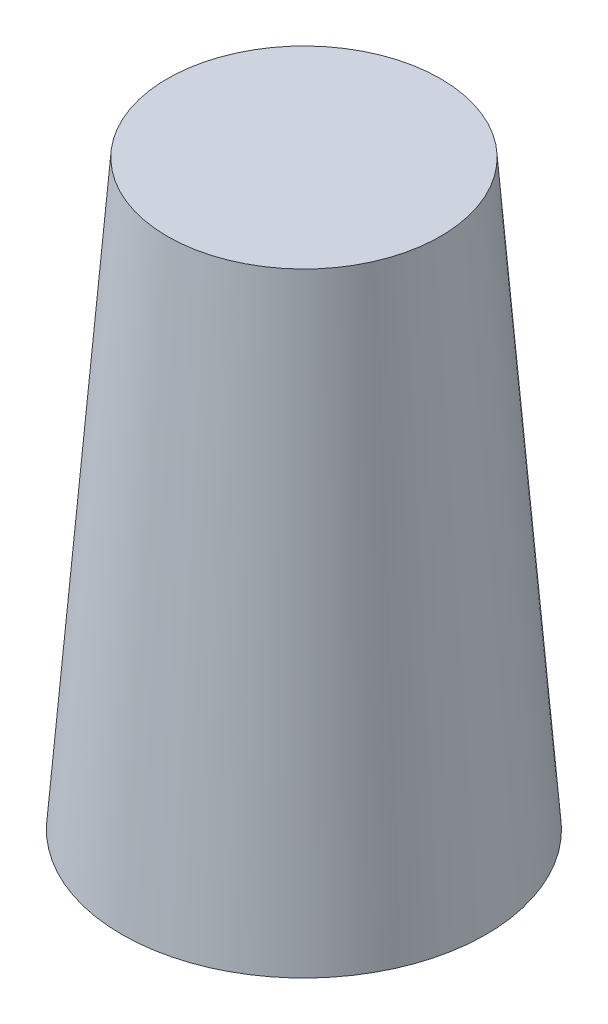
ISO-10303-21;
HEADER;
FILE_DESCRIPTION(('STEP AP214'),'2;1');
FILE_NAME('part.step','',(''),(''),'','','');
FILE_SCHEMA(('AUTOMOTIVE_DESIGN { 1 0 10303 214 1 1 1 1 }'));
ENDSEC;
DATA;
#1=APPLICATION_CONTEXT('core data for automotive mechanical design processes');
#2=APPLICATION_PROTOCOL_DEFINITION('international standard','automotive_design',2000,#1);
#3=PRODUCT_CONTEXT('',#1,'mechanical');
#4=PRODUCT('Part','Part','',(#3));
#5=PRODUCT_RELATED_PRODUCT_CATEGORY('part','',(#4));
#6=PRODUCT_DEFINITION_FORMATION('','',#4);
#7=PRODUCT_DEFINITION_CONTEXT('part definition',#1,'design');
#8=PRODUCT_DEFINITION('design','',#6,#7);
#9=PRODUCT_DEFINITION_SHAPE('','',#8);
#10=(LENGTH_UNIT() NAMED_UNIT(*) SI_UNIT(.MILLI.,.METRE.));
#11=(NAMED_UNIT(*) PLANE_ANGLE_UNIT() SI_UNIT($,.RADIAN.));
#12=(NAMED_UNIT(*) SI_UNIT($,.STERADIAN.) SOLID_ANGLE_UNIT());
#13=UNCERTAINTY_MEASURE_WITH_UNIT(LENGTH_MEASURE(1.E-05),#10,'distance_accuracy_value','');
#14=(GEOMETRIC_REPRESENTATION_CONTEXT(3) GLOBAL_UNCERTAINTY_ASSIGNED_CONTEXT((#13)) GLOBAL_UNIT_ASSIGNED_CONTEXT((#10,
#11,#12)) REPRESENTATION_CONTEXT('',''));
#15=CARTESIAN_POINT('',(0.,0.,0.));
#16=DIRECTION('',(0.,0.,1.));
#17=DIRECTION('',(1.,0.,0.));
#18=AXIS2_PLACEMENT_3D('',#15,#16,#17);
#19=CARTESIAN_POINT('',(0.,113.5,0.));
#20=DIRECTION('',(0.,1.,0.));
#21=DIRECTION('',(0.,0.,1.));
#22=AXIS2_PLACEMENT_3D('',#19,#20,#21);
#23=PLANE('',#22);
#24=CARTESIAN_POINT('',(0.,113.5,0.));
#25=DIRECTION('',(0.,1.,0.));
#26=DIRECTION('',(0.,0.,1.));
#27=AXIS2_PLACEMENT_3D('',#24,#25,#26);
#28=CIRCLE('',#27,25.6128047437484);
#29=CARTESIAN_POINT('',(0.,113.5,25.6128047437484));
#30=VERTEX_POINT('',#29);
#31=EDGE_CURVE('E10',#30,#30,#28,.T.);
#32=ORIENTED_EDGE('',*,*,#31,.F.);
#33=EDGE_LOOP('',(#32));
#34=FACE_BOUND('',#33,.T.);
#35=ADVANCED_FACE('F32',(#34),#23,.F.);
#36=CARTESIAN_POINT('',(0.,113.5,0.));
#37=DIRECTION('',(0.,-1.,0.));
#38=DIRECTION('',(0.,0.,-1.));
#39=AXIS2_PLACEMENT_3D('',#36,#37,#38);
#40=CONICAL_SURFACE('',#39,25.6128047437484,0.0781016777199855);
#41=CARTESIAN_POINT('',(0.,0.,0.));
#42=DIRECTION('',(0.,1.,0.));
#43=DIRECTION('',(0.,0.,1.));
#44=AXIS2_PLACEMENT_3D('',#41,#42,#43);
#45=CIRCLE('',#44,34.4954134394006);
#46=CARTESIAN_POINT('',(0.,0.,34.4954134394006));
#47=VERTEX_POINT('',#46);
#48=EDGE_CURVE('E38',#47,#47,#45,.T.);
#49=ORIENTED_EDGE('',*,*,#48,.F.);
#50=EDGE_LOOP('',(#49));
#51=FACE_BOUND('',#50,.T.);
#52=ORIENTED_EDGE('',*,*,#31,.T.);
#53=EDGE_LOOP('',(#52));
#54=FACE_BOUND('',#53,.T.);
#55=ADVANCED_FACE('F62',(#51,#54),#40,.F.);
#56=CARTESIAN_POINT('',(36.,0.,0.));
#57=DIRECTION('',(0.,1.,0.));
#58=DIRECTION('',(0.,0.,1.));
#59=AXIS2_PLACEMENT_3D('',#56,#57,#58);
#60=PLANE('',#59);
#61=CARTESIAN_POINT('',(0.,0.,0.));
#62=DIRECTION('',(0.,1.,0.));
#63=DIRECTION('',(0.,0.,1.));
#64=AXIS2_PLACEMENT_3D('',#61,#62,#63);
#65=CIRCLE('',#64,36.);
#66=CARTESIAN_POINT('',(0.,0.,36.));
#67=VERTEX_POINT('',#66);
#68=EDGE_CURVE('E42',#67,#67,#65,.T.);
#69=ORIENTED_EDGE('',*,*,#68,.F.);
#70=EDGE_LOOP('',(#69));
#71=FACE_BOUND('',#70,.T.);
#72=ORIENTED_EDGE('',*,*,#48,.T.);
#73=EDGE_LOOP('',(#72));
#74=FACE_BOUND('',#73,.T.);
#75=ADVANCED_FACE('F57',(#71,#74),#60,.F.);
#76=CARTESIAN_POINT('',(0.,0.,0.));
#77=DIRECTION('',(0.,-1.,0.));
#78=DIRECTION('',(0.,0.,-1.));
#79=AXIS2_PLACEMENT_3D('',#76,#77,#78);
#80=CONICAL_SURFACE('',#79,36.,0.0781016777199855);
#81=CARTESIAN_POINT('',(0.,115.,0.));
#82=DIRECTION('',(0.,1.,0.));
#83=DIRECTION('',(0.,0.,1.));
#84=AXIS2_PLACEMENT_3D('',#81,#82,#83);
#85=CIRCLE('',#84,27.);
#86=CARTESIAN_POINT('',(0.,115.,27.));
#87=VERTEX_POINT('',#86);
#88=EDGE_CURVE('E46',#87,#87,#85,.T.);
#89=ORIENTED_EDGE('',*,*,#88,.F.);
#90=EDGE_LOOP('',(#89));
#91=FACE_BOUND('',#90,.T.);
#92=ORIENTED_EDGE('',*,*,#68,.T.);
#93=EDGE_LOOP('',(#92));
#94=FACE_BOUND('',#93,.T.);
#95=ADVANCED_FACE('F54',(#91,#94),#80,.T.);
#96=CARTESIAN_POINT('',(0.,115.,0.));
#97=DIRECTION('',(0.,-1.,0.));
#98=DIRECTION('',(0.,0.,-1.));
#99=AXIS2_PLACEMENT_3D('',#96,#97,#98);
#100=PLANE('',#99);
#101=ORIENTED_EDGE('',*,*,#88,.T.);
#102=EDGE_LOOP('',(#101));
#103=FACE_BOUND('',#102,.T.);
#104=ADVANCED_FACE('F52',(#103),#100,.F.);
#105=CLOSED_SHELL('',(#35,#55,#75,#95,#104));
#106=MANIFOLD_SOLID_BREP('B2',#105);
#107=ADVANCED_BREP_SHAPE_REPRESENTATION('',(#18,#106),#14);
#108=SHAPE_DEFINITION_REPRESENTATION(#9,#107);
ENDSEC;
END-ISO-10303-21;
